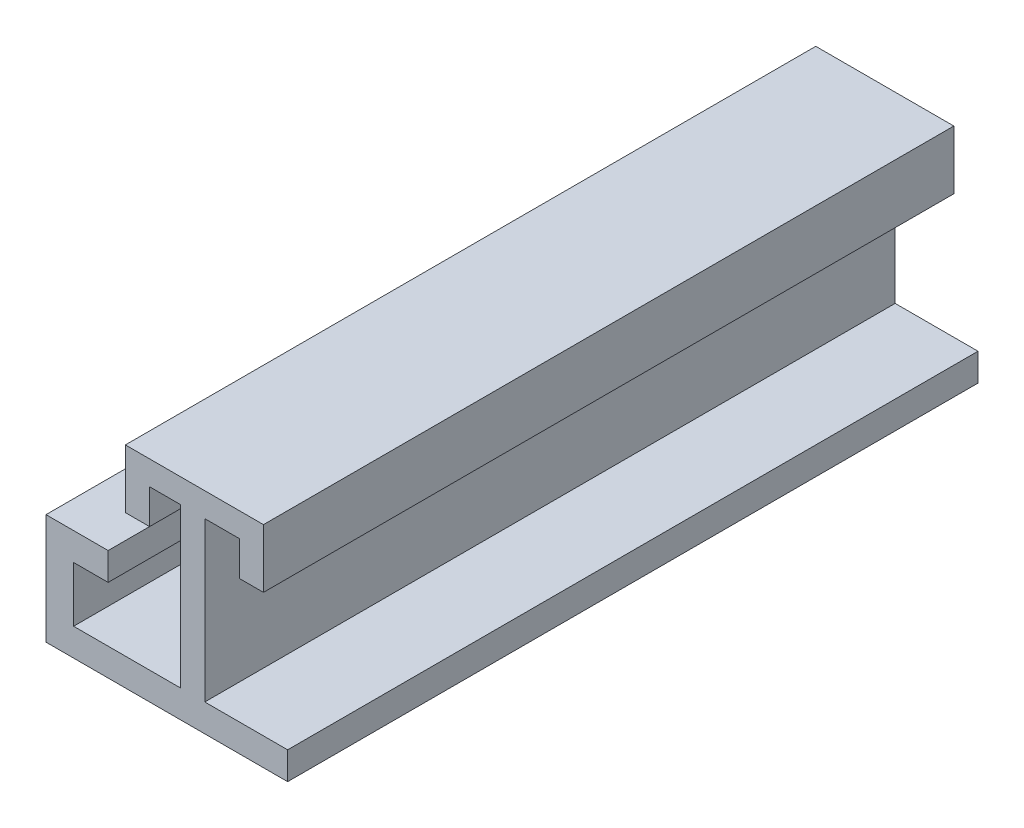
ISO-10303-21;
HEADER;
FILE_DESCRIPTION(('STEP AP214'),'2;1');
FILE_NAME('part.step','',(''),(''),'','','');
FILE_SCHEMA(('AUTOMOTIVE_DESIGN { 1 0 10303 214 1 1 1 1 }'));
ENDSEC;
DATA;
#1=APPLICATION_CONTEXT('core data for automotive mechanical design processes');
#2=APPLICATION_PROTOCOL_DEFINITION('international standard','automotive_design',2000,#1);
#3=PRODUCT_CONTEXT('',#1,'mechanical');
#4=PRODUCT('Part','Part','',(#3));
#5=PRODUCT_RELATED_PRODUCT_CATEGORY('part','',(#4));
#6=PRODUCT_DEFINITION_FORMATION('','',#4);
#7=PRODUCT_DEFINITION_CONTEXT('part definition',#1,'design');
#8=PRODUCT_DEFINITION('design','',#6,#7);
#9=PRODUCT_DEFINITION_SHAPE('','',#8);
#10=(LENGTH_UNIT() NAMED_UNIT(*) SI_UNIT(.MILLI.,.METRE.));
#11=(NAMED_UNIT(*) PLANE_ANGLE_UNIT() SI_UNIT($,.RADIAN.));
#12=(NAMED_UNIT(*) SI_UNIT($,.STERADIAN.) SOLID_ANGLE_UNIT());
#13=UNCERTAINTY_MEASURE_WITH_UNIT(LENGTH_MEASURE(1.E-05),#10,'distance_accuracy_value','');
#14=(GEOMETRIC_REPRESENTATION_CONTEXT(3) GLOBAL_UNCERTAINTY_ASSIGNED_CONTEXT((#13)) GLOBAL_UNIT_ASSIGNED_CONTEXT((#10,
#11,#12)) REPRESENTATION_CONTEXT('',''));
#15=CARTESIAN_POINT('',(0.,0.,0.));
#16=DIRECTION('',(0.,0.,1.));
#17=DIRECTION('',(1.,0.,0.));
#18=AXIS2_PLACEMENT_3D('',#15,#16,#17);
#19=CARTESIAN_POINT('',(0.,36.,100.));
#20=DIRECTION('',(0.,1.,0.));
#21=DIRECTION('',(0.,0.,1.));
#22=AXIS2_PLACEMENT_3D('',#19,#20,#21);
#23=PLANE('',#22);
#24=DIRECTION('',(1.,0.,0.));
#25=VECTOR('',#24,1.);
#26=CARTESIAN_POINT('',(0.,36.,-100.));
#27=LINE('',#26,#25);
#28=CARTESIAN_POINT('',(-20.,36.,-100.));
#29=VERTEX_POINT('',#28);
#30=CARTESIAN_POINT('',(-13.,36.,-100.));
#31=VERTEX_POINT('',#30);
#32=EDGE_CURVE('E204',#29,#31,#27,.T.);
#33=ORIENTED_EDGE('',*,*,#32,.T.);
#34=DIRECTION('',(0.,0.,-1.));
#35=VECTOR('',#34,1.);
#36=CARTESIAN_POINT('',(-13.,36.,100.));
#37=LINE('',#36,#35);
#38=CARTESIAN_POINT('',(-13.,36.,100.));
#39=VERTEX_POINT('',#38);
#40=EDGE_CURVE('E11',#39,#31,#37,.T.);
#41=ORIENTED_EDGE('',*,*,#40,.F.);
#42=DIRECTION('',(1.,0.,0.));
#43=VECTOR('',#42,1.);
#44=CARTESIAN_POINT('',(0.,36.,100.));
#45=LINE('',#44,#43);
#46=CARTESIAN_POINT('',(-20.,36.,100.));
#47=VERTEX_POINT('',#46);
#48=EDGE_CURVE('E128',#47,#39,#45,.T.);
#49=ORIENTED_EDGE('',*,*,#48,.F.);
#50=DIRECTION('',(0.,0.,-1.));
#51=VECTOR('',#50,1.);
#52=CARTESIAN_POINT('',(-20.,36.,100.));
#53=LINE('',#52,#51);
#54=EDGE_CURVE('E200',#47,#29,#53,.T.);
#55=ORIENTED_EDGE('',*,*,#54,.T.);
#56=EDGE_LOOP('',(#33,#41,#49,#55));
#57=FACE_BOUND('',#56,.T.);
#58=ADVANCED_FACE('F37',(#57),#23,.F.);
#59=CARTESIAN_POINT('',(-13.,0.,100.));
#60=DIRECTION('',(1.,0.,0.));
#61=DIRECTION('',(0.,0.,-1.));
#62=AXIS2_PLACEMENT_3D('',#59,#60,#61);
#63=PLANE('',#62);
#64=DIRECTION('',(0.,-1.,0.));
#65=VECTOR('',#64,1.);
#66=CARTESIAN_POINT('',(-13.,0.,-100.));
#67=LINE('',#66,#65);
#68=CARTESIAN_POINT('',(-13.,46.,-100.));
#69=VERTEX_POINT('',#68);
#70=EDGE_CURVE('E207',#69,#31,#67,.T.);
#71=ORIENTED_EDGE('',*,*,#70,.F.);
#72=DIRECTION('',(0.,0.,-1.));
#73=VECTOR('',#72,1.);
#74=CARTESIAN_POINT('',(-13.,46.,100.));
#75=LINE('',#74,#73);
#76=CARTESIAN_POINT('',(-13.,46.,100.));
#77=VERTEX_POINT('',#76);
#78=EDGE_CURVE('E44',#77,#69,#75,.T.);
#79=ORIENTED_EDGE('',*,*,#78,.F.);
#80=DIRECTION('',(0.,-1.,0.));
#81=VECTOR('',#80,1.);
#82=CARTESIAN_POINT('',(-13.,0.,100.));
#83=LINE('',#82,#81);
#84=EDGE_CURVE('E304',#77,#39,#83,.T.);
#85=ORIENTED_EDGE('',*,*,#84,.T.);
#86=ORIENTED_EDGE('',*,*,#40,.T.);
#87=EDGE_LOOP('',(#71,#79,#85,#86));
#88=FACE_BOUND('',#87,.T.);
#89=ADVANCED_FACE('F290',(#88),#63,.T.);
#90=CARTESIAN_POINT('',(0.,46.,100.));
#91=DIRECTION('',(0.,-1.,0.));
#92=DIRECTION('',(0.,0.,-1.));
#93=AXIS2_PLACEMENT_3D('',#90,#91,#92);
#94=PLANE('',#93);
#95=DIRECTION('',(-1.,0.,0.));
#96=VECTOR('',#95,1.);
#97=CARTESIAN_POINT('',(0.,46.,-100.));
#98=LINE('',#97,#96);
#99=CARTESIAN_POINT('',(-4.,46.,-100.));
#100=VERTEX_POINT('',#99);
#101=EDGE_CURVE('E210',#100,#69,#98,.T.);
#102=ORIENTED_EDGE('',*,*,#101,.F.);
#103=DIRECTION('',(0.,0.,-1.));
#104=VECTOR('',#103,1.);
#105=CARTESIAN_POINT('',(-4.,46.,100.));
#106=LINE('',#105,#104);
#107=CARTESIAN_POINT('',(-4.,46.,100.));
#108=VERTEX_POINT('',#107);
#109=EDGE_CURVE('E280',#108,#100,#106,.T.);
#110=ORIENTED_EDGE('',*,*,#109,.F.);
#111=DIRECTION('',(-1.,0.,0.));
#112=VECTOR('',#111,1.);
#113=CARTESIAN_POINT('',(0.,46.,100.));
#114=LINE('',#113,#112);
#115=EDGE_CURVE('E287',#108,#77,#114,.T.);
#116=ORIENTED_EDGE('',*,*,#115,.T.);
#117=ORIENTED_EDGE('',*,*,#78,.T.);
#118=EDGE_LOOP('',(#102,#110,#116,#117));
#119=FACE_BOUND('',#118,.T.);
#120=ADVANCED_FACE('F285',(#119),#94,.T.);
#121=CARTESIAN_POINT('',(-4.,0.,100.));
#122=DIRECTION('',(-1.,0.,0.));
#123=DIRECTION('',(0.,0.,1.));
#124=AXIS2_PLACEMENT_3D('',#121,#122,#123);
#125=PLANE('',#124);
#126=DIRECTION('',(0.,1.,0.));
#127=VECTOR('',#126,1.);
#128=CARTESIAN_POINT('',(-4.,0.,-100.));
#129=LINE('',#128,#127);
#130=CARTESIAN_POINT('',(-4.,0.,-100.));
#131=VERTEX_POINT('',#130);
#132=EDGE_CURVE('E213',#131,#100,#129,.T.);
#133=ORIENTED_EDGE('',*,*,#132,.F.);
#134=DIRECTION('',(0.,0.,-1.));
#135=VECTOR('',#134,1.);
#136=CARTESIAN_POINT('',(-4.,0.,100.));
#137=LINE('',#136,#135);
#138=CARTESIAN_POINT('',(-4.,0.,100.));
#139=VERTEX_POINT('',#138);
#140=EDGE_CURVE('E278',#139,#131,#137,.T.);
#141=ORIENTED_EDGE('',*,*,#140,.F.);
#142=DIRECTION('',(0.,1.,0.));
#143=VECTOR('',#142,1.);
#144=CARTESIAN_POINT('',(-4.,0.,100.));
#145=LINE('',#144,#143);
#146=EDGE_CURVE('E303',#139,#108,#145,.T.);
#147=ORIENTED_EDGE('',*,*,#146,.T.);
#148=ORIENTED_EDGE('',*,*,#109,.T.);
#149=EDGE_LOOP('',(#133,#141,#147,#148));
#150=FACE_BOUND('',#149,.T.);
#151=ADVANCED_FACE('F299',(#150),#125,.T.);
#152=CARTESIAN_POINT('',(0.,0.,100.));
#153=DIRECTION('',(0.,-1.,0.));
#154=DIRECTION('',(1.,0.,0.));
#155=AXIS2_PLACEMENT_3D('',#152,#153,#154);
#156=PLANE('',#155);
#157=DIRECTION('',(-1.,0.,0.));
#158=VECTOR('',#157,1.);
#159=CARTESIAN_POINT('',(0.,0.,-100.));
#160=LINE('',#159,#158);
#161=CARTESIAN_POINT('',(-35.,0.,-100.));
#162=VERTEX_POINT('',#161);
#163=EDGE_CURVE('E216',#131,#162,#160,.T.);
#164=ORIENTED_EDGE('',*,*,#163,.T.);
#165=DIRECTION('',(0.,0.,-1.));
#166=VECTOR('',#165,1.);
#167=CARTESIAN_POINT('',(-35.,0.,100.));
#168=LINE('',#167,#166);
#169=CARTESIAN_POINT('',(-35.,0.,100.));
#170=VERTEX_POINT('',#169);
#171=EDGE_CURVE('E275',#170,#162,#168,.T.);
#172=ORIENTED_EDGE('',*,*,#171,.F.);
#173=DIRECTION('',(-1.,0.,0.));
#174=VECTOR('',#173,1.);
#175=CARTESIAN_POINT('',(0.,0.,100.));
#176=LINE('',#175,#174);
#177=EDGE_CURVE('E306',#139,#170,#176,.T.);
#178=ORIENTED_EDGE('',*,*,#177,.F.);
#179=ORIENTED_EDGE('',*,*,#140,.T.);
#180=EDGE_LOOP('',(#164,#172,#178,#179));
#181=FACE_BOUND('',#180,.T.);
#182=ADVANCED_FACE('F359',(#181),#156,.F.);
#183=CARTESIAN_POINT('',(-35.,0.,100.));
#184=DIRECTION('',(-1.,0.,0.));
#185=DIRECTION('',(0.,0.,1.));
#186=AXIS2_PLACEMENT_3D('',#183,#184,#185);
#187=PLANE('',#186);
#188=DIRECTION('',(0.,1.,0.));
#189=VECTOR('',#188,1.);
#190=CARTESIAN_POINT('',(-35.,0.,-100.));
#191=LINE('',#190,#189);
#192=CARTESIAN_POINT('',(-35.,16.,-100.));
#193=VERTEX_POINT('',#192);
#194=EDGE_CURVE('E218',#162,#193,#191,.T.);
#195=ORIENTED_EDGE('',*,*,#194,.T.);
#196=DIRECTION('',(0.,0.,-1.));
#197=VECTOR('',#196,1.);
#198=CARTESIAN_POINT('',(-35.,16.,100.));
#199=LINE('',#198,#197);
#200=CARTESIAN_POINT('',(-35.,16.,100.));
#201=VERTEX_POINT('',#200);
#202=EDGE_CURVE('E272',#201,#193,#199,.T.);
#203=ORIENTED_EDGE('',*,*,#202,.F.);
#204=DIRECTION('',(0.,1.,0.));
#205=VECTOR('',#204,1.);
#206=CARTESIAN_POINT('',(-35.,0.,100.));
#207=LINE('',#206,#205);
#208=EDGE_CURVE('E312',#170,#201,#207,.T.);
#209=ORIENTED_EDGE('',*,*,#208,.F.);
#210=ORIENTED_EDGE('',*,*,#171,.T.);
#211=EDGE_LOOP('',(#195,#203,#209,#210));
#212=FACE_BOUND('',#211,.T.);
#213=ADVANCED_FACE('F360',(#212),#187,.F.);
#214=CARTESIAN_POINT('',(0.,16.,100.));
#215=DIRECTION('',(0.,1.,0.));
#216=DIRECTION('',(0.,0.,1.));
#217=AXIS2_PLACEMENT_3D('',#214,#215,#216);
#218=PLANE('',#217);
#219=DIRECTION('',(1.,0.,0.));
#220=VECTOR('',#219,1.);
#221=CARTESIAN_POINT('',(0.,16.,-100.));
#222=LINE('',#221,#220);
#223=CARTESIAN_POINT('',(-25.,16.,-100.));
#224=VERTEX_POINT('',#223);
#225=EDGE_CURVE('E221',#193,#224,#222,.T.);
#226=ORIENTED_EDGE('',*,*,#225,.T.);
#227=DIRECTION('',(0.,0.,-1.));
#228=VECTOR('',#227,1.);
#229=CARTESIAN_POINT('',(-25.,16.,100.));
#230=LINE('',#229,#228);
#231=CARTESIAN_POINT('',(-25.,16.,100.));
#232=VERTEX_POINT('',#231);
#233=EDGE_CURVE('E269',#232,#224,#230,.T.);
#234=ORIENTED_EDGE('',*,*,#233,.F.);
#235=DIRECTION('',(1.,0.,0.));
#236=VECTOR('',#235,1.);
#237=CARTESIAN_POINT('',(0.,16.,100.));
#238=LINE('',#237,#236);
#239=EDGE_CURVE('E315',#201,#232,#238,.T.);
#240=ORIENTED_EDGE('',*,*,#239,.F.);
#241=ORIENTED_EDGE('',*,*,#202,.T.);
#242=EDGE_LOOP('',(#226,#234,#240,#241));
#243=FACE_BOUND('',#242,.T.);
#244=ADVANCED_FACE('F363',(#243),#218,.F.);
#245=CARTESIAN_POINT('',(-25.,0.,100.));
#246=DIRECTION('',(-1.,0.,0.));
#247=DIRECTION('',(0.,0.,1.));
#248=AXIS2_PLACEMENT_3D('',#245,#246,#247);
#249=PLANE('',#248);
#250=DIRECTION('',(0.,1.,0.));
#251=VECTOR('',#250,1.);
#252=CARTESIAN_POINT('',(-25.,0.,-100.));
#253=LINE('',#252,#251);
#254=CARTESIAN_POINT('',(-25.,24.,-100.));
#255=VERTEX_POINT('',#254);
#256=EDGE_CURVE('E223',#224,#255,#253,.T.);
#257=ORIENTED_EDGE('',*,*,#256,.T.);
#258=DIRECTION('',(0.,0.,-1.));
#259=VECTOR('',#258,1.);
#260=CARTESIAN_POINT('',(-25.,24.,100.));
#261=LINE('',#260,#259);
#262=CARTESIAN_POINT('',(-25.,24.,100.));
#263=VERTEX_POINT('',#262);
#264=EDGE_CURVE('E267',#263,#255,#261,.T.);
#265=ORIENTED_EDGE('',*,*,#264,.F.);
#266=DIRECTION('',(0.,1.,0.));
#267=VECTOR('',#266,1.);
#268=CARTESIAN_POINT('',(-25.,0.,100.));
#269=LINE('',#268,#267);
#270=EDGE_CURVE('E317',#232,#263,#269,.T.);
#271=ORIENTED_EDGE('',*,*,#270,.F.);
#272=ORIENTED_EDGE('',*,*,#233,.T.);
#273=EDGE_LOOP('',(#257,#265,#271,#272));
#274=FACE_BOUND('',#273,.T.);
#275=ADVANCED_FACE('F367',(#274),#249,.F.);
#276=CARTESIAN_POINT('',(0.,24.,100.));
#277=DIRECTION('',(0.,1.,0.));
#278=DIRECTION('',(0.,0.,1.));
#279=AXIS2_PLACEMENT_3D('',#276,#277,#278);
#280=PLANE('',#279);
#281=DIRECTION('',(1.,0.,0.));
#282=VECTOR('',#281,1.);
#283=CARTESIAN_POINT('',(0.,24.,-100.));
#284=LINE('',#283,#282);
#285=CARTESIAN_POINT('',(-43.,24.,-100.));
#286=VERTEX_POINT('',#285);
#287=EDGE_CURVE('E226',#286,#255,#284,.T.);
#288=ORIENTED_EDGE('',*,*,#287,.F.);
#289=DIRECTION('',(0.,0.,-1.));
#290=VECTOR('',#289,1.);
#291=CARTESIAN_POINT('',(-43.,24.,100.));
#292=LINE('',#291,#290);
#293=CARTESIAN_POINT('',(-43.,24.,100.));
#294=VERTEX_POINT('',#293);
#295=EDGE_CURVE('E265',#294,#286,#292,.T.);
#296=ORIENTED_EDGE('',*,*,#295,.F.);
#297=DIRECTION('',(1.,0.,0.));
#298=VECTOR('',#297,1.);
#299=CARTESIAN_POINT('',(0.,24.,100.));
#300=LINE('',#299,#298);
#301=EDGE_CURVE('E319',#294,#263,#300,.T.);
#302=ORIENTED_EDGE('',*,*,#301,.T.);
#303=ORIENTED_EDGE('',*,*,#264,.T.);
#304=EDGE_LOOP('',(#288,#296,#302,#303));
#305=FACE_BOUND('',#304,.T.);
#306=ADVANCED_FACE('F371',(#305),#280,.T.);
#307=CARTESIAN_POINT('',(-43.,0.,100.));
#308=DIRECTION('',(-1.,0.,0.));
#309=DIRECTION('',(0.,0.,1.));
#310=AXIS2_PLACEMENT_3D('',#307,#308,#309);
#311=PLANE('',#310);
#312=DIRECTION('',(0.,1.,0.));
#313=VECTOR('',#312,1.);
#314=CARTESIAN_POINT('',(-43.,0.,-100.));
#315=LINE('',#314,#313);
#316=CARTESIAN_POINT('',(-43.,-8.00000000000001,-100.));
#317=VERTEX_POINT('',#316);
#318=EDGE_CURVE('E229',#317,#286,#315,.T.);
#319=ORIENTED_EDGE('',*,*,#318,.F.);
#320=DIRECTION('',(0.,0.,-1.));
#321=VECTOR('',#320,1.);
#322=CARTESIAN_POINT('',(-43.,-8.00000000000001,100.));
#323=LINE('',#322,#321);
#324=CARTESIAN_POINT('',(-43.,-8.00000000000001,100.));
#325=VERTEX_POINT('',#324);
#326=EDGE_CURVE('E262',#325,#317,#323,.T.);
#327=ORIENTED_EDGE('',*,*,#326,.F.);
#328=DIRECTION('',(0.,1.,0.));
#329=VECTOR('',#328,1.);
#330=CARTESIAN_POINT('',(-43.,0.,100.));
#331=LINE('',#330,#329);
#332=EDGE_CURVE('E322',#325,#294,#331,.T.);
#333=ORIENTED_EDGE('',*,*,#332,.T.);
#334=ORIENTED_EDGE('',*,*,#295,.T.);
#335=EDGE_LOOP('',(#319,#327,#333,#334));
#336=FACE_BOUND('',#335,.T.);
#337=ADVANCED_FACE('F375',(#336),#311,.T.);
#338=CARTESIAN_POINT('',(0.,-8.00000000000001,100.));
#339=DIRECTION('',(0.,-1.,0.));
#340=DIRECTION('',(1.,0.,0.));
#341=AXIS2_PLACEMENT_3D('',#338,#339,#340);
#342=PLANE('',#341);
#343=DIRECTION('',(0.,0.,1.));
#344=VECTOR('',#343,1.);
#345=CARTESIAN_POINT('',(27.,-8.,-100.));
#346=LINE('',#345,#344);
#347=CARTESIAN_POINT('',(27.,-8.,-100.));
#348=VERTEX_POINT('',#347);
#349=CARTESIAN_POINT('',(27.,-8.,100.));
#350=VERTEX_POINT('',#349);
#351=EDGE_CURVE('E51',#348,#350,#346,.T.);
#352=ORIENTED_EDGE('',*,*,#351,.T.);
#353=DIRECTION('',(-1.,0.,0.));
#354=VECTOR('',#353,1.);
#355=CARTESIAN_POINT('',(0.,-8.00000000000001,100.));
#356=LINE('',#355,#354);
#357=EDGE_CURVE('E325',#350,#325,#356,.T.);
#358=ORIENTED_EDGE('',*,*,#357,.T.);
#359=ORIENTED_EDGE('',*,*,#326,.T.);
#360=DIRECTION('',(-1.,0.,0.));
#361=VECTOR('',#360,1.);
#362=CARTESIAN_POINT('',(0.,-8.00000000000001,-100.));
#363=LINE('',#362,#361);
#364=EDGE_CURVE('E232',#348,#317,#363,.T.);
#365=ORIENTED_EDGE('',*,*,#364,.F.);
#366=EDGE_LOOP('',(#352,#358,#359,#365));
#367=FACE_BOUND('',#366,.T.);
#368=ADVANCED_FACE('F379',(#367),#342,.T.);
#369=CARTESIAN_POINT('',(27.,0.,100.));
#370=VERTEX_POINT('',#369);
#371=CARTESIAN_POINT('',(3.,0.,100.));
#372=VERTEX_POINT('',#371);
#373=EDGE_CURVE('E313',#370,#372,#176,.T.);
#374=ORIENTED_EDGE('',*,*,#373,.F.);
#375=DIRECTION('',(0.,0.,1.));
#376=VECTOR('',#375,1.);
#377=CARTESIAN_POINT('',(27.,0.,-100.));
#378=LINE('',#377,#376);
#379=CARTESIAN_POINT('',(27.,0.,-100.));
#380=VERTEX_POINT('',#379);
#381=EDGE_CURVE('E464',#380,#370,#378,.T.);
#382=ORIENTED_EDGE('',*,*,#381,.F.);
#383=CARTESIAN_POINT('',(3.,0.,-100.));
#384=VERTEX_POINT('',#383);
#385=EDGE_CURVE('E219',#380,#384,#160,.T.);
#386=ORIENTED_EDGE('',*,*,#385,.T.);
#387=DIRECTION('',(0.,0.,-1.));
#388=VECTOR('',#387,1.);
#389=CARTESIAN_POINT('',(3.,0.,100.));
#390=LINE('',#389,#388);
#391=EDGE_CURVE('E259',#372,#384,#390,.T.);
#392=ORIENTED_EDGE('',*,*,#391,.F.);
#393=EDGE_LOOP('',(#374,#382,#386,#392));
#394=FACE_BOUND('',#393,.T.);
#395=ADVANCED_FACE('F383',(#394),#156,.F.);
#396=CARTESIAN_POINT('',(3.,0.,100.));
#397=DIRECTION('',(-1.,0.,0.));
#398=DIRECTION('',(0.,0.,1.));
#399=AXIS2_PLACEMENT_3D('',#396,#397,#398);
#400=PLANE('',#399);
#401=DIRECTION('',(0.,1.,0.));
#402=VECTOR('',#401,1.);
#403=CARTESIAN_POINT('',(3.,0.,-100.));
#404=LINE('',#403,#402);
#405=CARTESIAN_POINT('',(3.,46.,-100.));
#406=VERTEX_POINT('',#405);
#407=EDGE_CURVE('E234',#384,#406,#404,.T.);
#408=ORIENTED_EDGE('',*,*,#407,.T.);
#409=DIRECTION('',(0.,0.,-1.));
#410=VECTOR('',#409,1.);
#411=CARTESIAN_POINT('',(3.,46.,100.));
#412=LINE('',#411,#410);
#413=CARTESIAN_POINT('',(3.,46.,100.));
#414=VERTEX_POINT('',#413);
#415=EDGE_CURVE('E256',#414,#406,#412,.T.);
#416=ORIENTED_EDGE('',*,*,#415,.F.);
#417=DIRECTION('',(0.,1.,0.));
#418=VECTOR('',#417,1.);
#419=CARTESIAN_POINT('',(3.,0.,100.));
#420=LINE('',#419,#418);
#421=EDGE_CURVE('E327',#372,#414,#420,.T.);
#422=ORIENTED_EDGE('',*,*,#421,.F.);
#423=ORIENTED_EDGE('',*,*,#391,.T.);
#424=EDGE_LOOP('',(#408,#416,#422,#423));
#425=FACE_BOUND('',#424,.T.);
#426=ADVANCED_FACE('F387',(#425),#400,.F.);
#427=CARTESIAN_POINT('',(0.,46.,100.));
#428=DIRECTION('',(0.,1.,0.));
#429=DIRECTION('',(0.,0.,1.));
#430=AXIS2_PLACEMENT_3D('',#427,#428,#429);
#431=PLANE('',#430);
#432=DIRECTION('',(1.,0.,0.));
#433=VECTOR('',#432,1.);
#434=CARTESIAN_POINT('',(0.,46.,-100.));
#435=LINE('',#434,#433);
#436=CARTESIAN_POINT('',(13.,46.,-100.));
#437=VERTEX_POINT('',#436);
#438=EDGE_CURVE('E236',#406,#437,#435,.T.);
#439=ORIENTED_EDGE('',*,*,#438,.T.);
#440=DIRECTION('',(0.,0.,-1.));
#441=VECTOR('',#440,1.);
#442=CARTESIAN_POINT('',(13.,46.,100.));
#443=LINE('',#442,#441);
#444=CARTESIAN_POINT('',(13.,46.,100.));
#445=VERTEX_POINT('',#444);
#446=EDGE_CURVE('E253',#445,#437,#443,.T.);
#447=ORIENTED_EDGE('',*,*,#446,.F.);
#448=DIRECTION('',(1.,0.,0.));
#449=VECTOR('',#448,1.);
#450=CARTESIAN_POINT('',(0.,46.,100.));
#451=LINE('',#450,#449);
#452=EDGE_CURVE('E329',#414,#445,#451,.T.);
#453=ORIENTED_EDGE('',*,*,#452,.F.);
#454=ORIENTED_EDGE('',*,*,#415,.T.);
#455=EDGE_LOOP('',(#439,#447,#453,#454));
#456=FACE_BOUND('',#455,.T.);
#457=ADVANCED_FACE('F391',(#456),#431,.F.);
#458=CARTESIAN_POINT('',(13.,0.,100.));
#459=DIRECTION('',(1.,0.,0.));
#460=DIRECTION('',(0.,0.,-1.));
#461=AXIS2_PLACEMENT_3D('',#458,#459,#460);
#462=PLANE('',#461);
#463=DIRECTION('',(0.,-1.,0.));
#464=VECTOR('',#463,1.);
#465=CARTESIAN_POINT('',(13.,0.,-100.));
#466=LINE('',#465,#464);
#467=CARTESIAN_POINT('',(13.,36.,-100.));
#468=VERTEX_POINT('',#467);
#469=EDGE_CURVE('E238',#437,#468,#466,.T.);
#470=ORIENTED_EDGE('',*,*,#469,.T.);
#471=DIRECTION('',(0.,0.,-1.));
#472=VECTOR('',#471,1.);
#473=CARTESIAN_POINT('',(13.,36.,100.));
#474=LINE('',#473,#472);
#475=CARTESIAN_POINT('',(13.,36.,100.));
#476=VERTEX_POINT('',#475);
#477=EDGE_CURVE('E251',#476,#468,#474,.T.);
#478=ORIENTED_EDGE('',*,*,#477,.F.);
#479=DIRECTION('',(0.,-1.,0.));
#480=VECTOR('',#479,1.);
#481=CARTESIAN_POINT('',(13.,0.,100.));
#482=LINE('',#481,#480);
#483=EDGE_CURVE('E331',#445,#476,#482,.T.);
#484=ORIENTED_EDGE('',*,*,#483,.F.);
#485=ORIENTED_EDGE('',*,*,#446,.T.);
#486=EDGE_LOOP('',(#470,#478,#484,#485));
#487=FACE_BOUND('',#486,.T.);
#488=ADVANCED_FACE('F395',(#487),#462,.F.);
#489=CARTESIAN_POINT('',(0.,36.,100.));
#490=DIRECTION('',(0.,-1.,0.));
#491=DIRECTION('',(0.,0.,-1.));
#492=AXIS2_PLACEMENT_3D('',#489,#490,#491);
#493=PLANE('',#492);
#494=DIRECTION('',(-1.,0.,0.));
#495=VECTOR('',#494,1.);
#496=CARTESIAN_POINT('',(0.,36.,-100.));
#497=LINE('',#496,#495);
#498=CARTESIAN_POINT('',(20.,36.,-100.));
#499=VERTEX_POINT('',#498);
#500=EDGE_CURVE('E241',#499,#468,#497,.T.);
#501=ORIENTED_EDGE('',*,*,#500,.F.);
#502=DIRECTION('',(0.,0.,-1.));
#503=VECTOR('',#502,1.);
#504=CARTESIAN_POINT('',(20.,36.,100.));
#505=LINE('',#504,#503);
#506=CARTESIAN_POINT('',(20.,36.,100.));
#507=VERTEX_POINT('',#506);
#508=EDGE_CURVE('E188',#507,#499,#505,.T.);
#509=ORIENTED_EDGE('',*,*,#508,.F.);
#510=DIRECTION('',(-1.,0.,0.));
#511=VECTOR('',#510,1.);
#512=CARTESIAN_POINT('',(0.,36.,100.));
#513=LINE('',#512,#511);
#514=EDGE_CURVE('E196',#507,#476,#513,.T.);
#515=ORIENTED_EDGE('',*,*,#514,.T.);
#516=ORIENTED_EDGE('',*,*,#477,.T.);
#517=EDGE_LOOP('',(#501,#509,#515,#516));
#518=FACE_BOUND('',#517,.T.);
#519=ADVANCED_FACE('F334',(#518),#493,.T.);
#520=CARTESIAN_POINT('',(20.,0.,100.));
#521=DIRECTION('',(1.,0.,0.));
#522=DIRECTION('',(0.,0.,-1.));
#523=AXIS2_PLACEMENT_3D('',#520,#521,#522);
#524=PLANE('',#523);
#525=DIRECTION('',(0.,-1.,0.));
#526=VECTOR('',#525,1.);
#527=CARTESIAN_POINT('',(20.,0.,-100.));
#528=LINE('',#527,#526);
#529=CARTESIAN_POINT('',(20.,53.,-100.));
#530=VERTEX_POINT('',#529);
#531=EDGE_CURVE('E183',#530,#499,#528,.T.);
#532=ORIENTED_EDGE('',*,*,#531,.F.);
#533=DIRECTION('',(0.,0.,-1.));
#534=VECTOR('',#533,1.);
#535=CARTESIAN_POINT('',(20.,53.,100.));
#536=LINE('',#535,#534);
#537=CARTESIAN_POINT('',(20.,53.,100.));
#538=VERTEX_POINT('',#537);
#539=EDGE_CURVE('E178',#538,#530,#536,.T.);
#540=ORIENTED_EDGE('',*,*,#539,.F.);
#541=DIRECTION('',(0.,-1.,0.));
#542=VECTOR('',#541,1.);
#543=CARTESIAN_POINT('',(20.,0.,100.));
#544=LINE('',#543,#542);
#545=EDGE_CURVE('E181',#538,#507,#544,.T.);
#546=ORIENTED_EDGE('',*,*,#545,.T.);
#547=ORIENTED_EDGE('',*,*,#508,.T.);
#548=EDGE_LOOP('',(#532,#540,#546,#547));
#549=FACE_BOUND('',#548,.T.);
#550=ADVANCED_FACE('F180',(#549),#524,.T.);
#551=CARTESIAN_POINT('',(0.,53.,100.));
#552=DIRECTION('',(0.,1.,0.));
#553=DIRECTION('',(0.,0.,1.));
#554=AXIS2_PLACEMENT_3D('',#551,#552,#553);
#555=PLANE('',#554);
#556=DIRECTION('',(1.,0.,0.));
#557=VECTOR('',#556,1.);
#558=CARTESIAN_POINT('',(0.,53.,-100.));
#559=LINE('',#558,#557);
#560=CARTESIAN_POINT('',(-20.,53.,-100.));
#561=VERTEX_POINT('',#560);
#562=EDGE_CURVE('E245',#561,#530,#559,.T.);
#563=ORIENTED_EDGE('',*,*,#562,.F.);
#564=DIRECTION('',(0.,0.,-1.));
#565=VECTOR('',#564,1.);
#566=CARTESIAN_POINT('',(-20.,53.,100.));
#567=LINE('',#566,#565);
#568=CARTESIAN_POINT('',(-20.,53.,100.));
#569=VERTEX_POINT('',#568);
#570=EDGE_CURVE('E189',#569,#561,#567,.T.);
#571=ORIENTED_EDGE('',*,*,#570,.F.);
#572=DIRECTION('',(1.,0.,0.));
#573=VECTOR('',#572,1.);
#574=CARTESIAN_POINT('',(0.,53.,100.));
#575=LINE('',#574,#573);
#576=EDGE_CURVE('E194',#569,#538,#575,.T.);
#577=ORIENTED_EDGE('',*,*,#576,.T.);
#578=ORIENTED_EDGE('',*,*,#539,.T.);
#579=EDGE_LOOP('',(#563,#571,#577,#578));
#580=FACE_BOUND('',#579,.T.);
#581=ADVANCED_FACE('F198',(#580),#555,.T.);
#582=CARTESIAN_POINT('',(-20.,0.,100.));
#583=DIRECTION('',(1.,0.,0.));
#584=DIRECTION('',(0.,0.,-1.));
#585=AXIS2_PLACEMENT_3D('',#582,#583,#584);
#586=PLANE('',#585);
#587=DIRECTION('',(0.,-1.,0.));
#588=VECTOR('',#587,1.);
#589=CARTESIAN_POINT('',(-20.,0.,-100.));
#590=LINE('',#589,#588);
#591=EDGE_CURVE('E122',#561,#29,#590,.T.);
#592=ORIENTED_EDGE('',*,*,#591,.T.);
#593=ORIENTED_EDGE('',*,*,#54,.F.);
#594=DIRECTION('',(0.,-1.,0.));
#595=VECTOR('',#594,1.);
#596=CARTESIAN_POINT('',(-20.,0.,100.));
#597=LINE('',#596,#595);
#598=EDGE_CURVE('E60',#569,#47,#597,.T.);
#599=ORIENTED_EDGE('',*,*,#598,.F.);
#600=ORIENTED_EDGE('',*,*,#570,.T.);
#601=EDGE_LOOP('',(#592,#593,#599,#600));
#602=FACE_BOUND('',#601,.T.);
#603=ADVANCED_FACE('F338',(#602),#586,.F.);
#604=CARTESIAN_POINT('',(0.,0.,100.));
#605=DIRECTION('',(0.,0.,1.));
#606=DIRECTION('',(1.,0.,0.));
#607=AXIS2_PLACEMENT_3D('',#604,#605,#606);
#608=PLANE('',#607);
#609=DIRECTION('',(0.,-1.,0.));
#610=VECTOR('',#609,1.);
#611=CARTESIAN_POINT('',(27.,0.,100.));
#612=LINE('',#611,#610);
#613=EDGE_CURVE('E461',#370,#350,#612,.T.);
#614=ORIENTED_EDGE('',*,*,#613,.F.);
#615=ORIENTED_EDGE('',*,*,#373,.T.);
#616=ORIENTED_EDGE('',*,*,#421,.T.);
#617=ORIENTED_EDGE('',*,*,#452,.T.);
#618=ORIENTED_EDGE('',*,*,#483,.T.);
#619=ORIENTED_EDGE('',*,*,#514,.F.);
#620=ORIENTED_EDGE('',*,*,#545,.F.);
#621=ORIENTED_EDGE('',*,*,#576,.F.);
#622=ORIENTED_EDGE('',*,*,#598,.T.);
#623=ORIENTED_EDGE('',*,*,#48,.T.);
#624=ORIENTED_EDGE('',*,*,#84,.F.);
#625=ORIENTED_EDGE('',*,*,#115,.F.);
#626=ORIENTED_EDGE('',*,*,#146,.F.);
#627=ORIENTED_EDGE('',*,*,#177,.T.);
#628=ORIENTED_EDGE('',*,*,#208,.T.);
#629=ORIENTED_EDGE('',*,*,#239,.T.);
#630=ORIENTED_EDGE('',*,*,#270,.T.);
#631=ORIENTED_EDGE('',*,*,#301,.F.);
#632=ORIENTED_EDGE('',*,*,#332,.F.);
#633=ORIENTED_EDGE('',*,*,#357,.F.);
#634=EDGE_LOOP('',(#614,#615,#616,#617,#618,#619,#620,#621,#622,#623,#624,#625,#626,#627,#628,
#629,#630,#631,#632,#633));
#635=FACE_BOUND('',#634,.T.);
#636=ADVANCED_FACE('F193',(#635),#608,.T.);
#637=CARTESIAN_POINT('',(0.,0.,-100.));
#638=DIRECTION('',(0.,0.,1.));
#639=DIRECTION('',(1.,0.,0.));
#640=AXIS2_PLACEMENT_3D('',#637,#638,#639);
#641=PLANE('',#640);
#642=ORIENTED_EDGE('',*,*,#385,.F.);
#643=DIRECTION('',(0.,-1.,0.));
#644=VECTOR('',#643,1.);
#645=CARTESIAN_POINT('',(27.,0.,-100.));
#646=LINE('',#645,#644);
#647=EDGE_CURVE('E467',#380,#348,#646,.T.);
#648=ORIENTED_EDGE('',*,*,#647,.T.);
#649=ORIENTED_EDGE('',*,*,#364,.T.);
#650=ORIENTED_EDGE('',*,*,#318,.T.);
#651=ORIENTED_EDGE('',*,*,#287,.T.);
#652=ORIENTED_EDGE('',*,*,#256,.F.);
#653=ORIENTED_EDGE('',*,*,#225,.F.);
#654=ORIENTED_EDGE('',*,*,#194,.F.);
#655=ORIENTED_EDGE('',*,*,#163,.F.);
#656=ORIENTED_EDGE('',*,*,#132,.T.);
#657=ORIENTED_EDGE('',*,*,#101,.T.);
#658=ORIENTED_EDGE('',*,*,#70,.T.);
#659=ORIENTED_EDGE('',*,*,#32,.F.);
#660=ORIENTED_EDGE('',*,*,#591,.F.);
#661=ORIENTED_EDGE('',*,*,#562,.T.);
#662=ORIENTED_EDGE('',*,*,#531,.T.);
#663=ORIENTED_EDGE('',*,*,#500,.T.);
#664=ORIENTED_EDGE('',*,*,#469,.F.);
#665=ORIENTED_EDGE('',*,*,#438,.F.);
#666=ORIENTED_EDGE('',*,*,#407,.F.);
#667=EDGE_LOOP('',(#642,#648,#649,#650,#651,#652,#653,#654,#655,#656,#657,#658,#659,#660,#661,
#662,#663,#664,#665,#666));
#668=FACE_BOUND('',#667,.T.);
#669=ADVANCED_FACE('F294',(#668),#641,.F.);
#670=CARTESIAN_POINT('',(27.,0.,-100.));
#671=DIRECTION('',(-1.,0.,0.));
#672=DIRECTION('',(0.,0.,1.));
#673=AXIS2_PLACEMENT_3D('',#670,#671,#672);
#674=PLANE('',#673);
#675=ORIENTED_EDGE('',*,*,#613,.T.);
#676=ORIENTED_EDGE('',*,*,#351,.F.);
#677=ORIENTED_EDGE('',*,*,#647,.F.);
#678=ORIENTED_EDGE('',*,*,#381,.T.);
#679=EDGE_LOOP('',(#675,#676,#677,#678));
#680=FACE_BOUND('',#679,.T.);
#681=ADVANCED_FACE('F448',(#680),#674,.F.);
#682=CLOSED_SHELL('',(#58,#89,#120,#151,#182,#213,#244,#275,#306,#337,#368,#395,#426,#457,#488,
#519,#550,#581,#603,#636,#669,#681));
#683=MANIFOLD_SOLID_BREP('B2',#682);
#684=ADVANCED_BREP_SHAPE_REPRESENTATION('',(#18,#683),#14);
#685=SHAPE_DEFINITION_REPRESENTATION(#9,#684);
ENDSEC;
END-ISO-10303-21;
